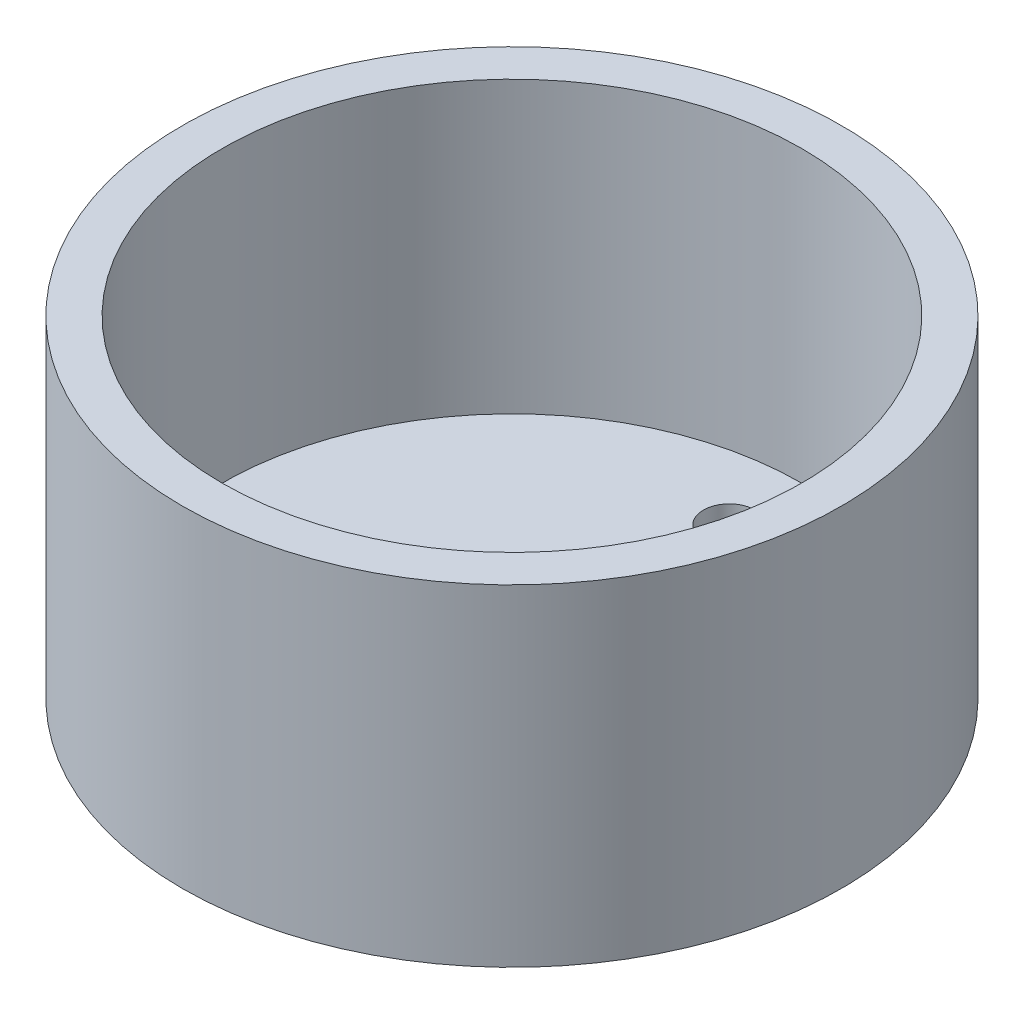
ISO-10303-21;
HEADER;
FILE_DESCRIPTION(('STEP AP214'),'2;1');
FILE_NAME('part.step','',(''),(''),'','','');
FILE_SCHEMA(('AUTOMOTIVE_DESIGN { 1 0 10303 214 1 1 1 1 }'));
ENDSEC;
DATA;
#1=APPLICATION_CONTEXT('core data for automotive mechanical design processes');
#2=APPLICATION_PROTOCOL_DEFINITION('international standard','automotive_design',2000,#1);
#3=PRODUCT_CONTEXT('',#1,'mechanical');
#4=PRODUCT('Part','Part','',(#3));
#5=PRODUCT_RELATED_PRODUCT_CATEGORY('part','',(#4));
#6=PRODUCT_DEFINITION_FORMATION('','',#4);
#7=PRODUCT_DEFINITION_CONTEXT('part definition',#1,'design');
#8=PRODUCT_DEFINITION('design','',#6,#7);
#9=PRODUCT_DEFINITION_SHAPE('','',#8);
#10=(LENGTH_UNIT() NAMED_UNIT(*) SI_UNIT(.MILLI.,.METRE.));
#11=(NAMED_UNIT(*) PLANE_ANGLE_UNIT() SI_UNIT($,.RADIAN.));
#12=(NAMED_UNIT(*) SI_UNIT($,.STERADIAN.) SOLID_ANGLE_UNIT());
#13=UNCERTAINTY_MEASURE_WITH_UNIT(LENGTH_MEASURE(1.E-05),#10,'distance_accuracy_value','');
#14=(GEOMETRIC_REPRESENTATION_CONTEXT(3) GLOBAL_UNCERTAINTY_ASSIGNED_CONTEXT((#13)) GLOBAL_UNIT_ASSIGNED_CONTEXT((#10,
#11,#12)) REPRESENTATION_CONTEXT('',''));
#15=CARTESIAN_POINT('',(0.,0.,0.));
#16=DIRECTION('',(0.,0.,1.));
#17=DIRECTION('',(1.,0.,0.));
#18=AXIS2_PLACEMENT_3D('',#15,#16,#17);
#19=CARTESIAN_POINT('',(0.,50.8,0.));
#20=DIRECTION('',(0.,-1.,0.));
#21=DIRECTION('',(0.,0.,-1.));
#22=AXIS2_PLACEMENT_3D('',#19,#20,#21);
#23=CYLINDRICAL_SURFACE('',#22,50.546);
#24=CARTESIAN_POINT('',(0.,50.8,0.));
#25=DIRECTION('',(0.,1.,0.));
#26=DIRECTION('',(0.,0.,1.));
#27=AXIS2_PLACEMENT_3D('',#24,#25,#26);
#28=CIRCLE('',#27,50.546);
#29=CARTESIAN_POINT('',(0.,50.8,50.546));
#30=VERTEX_POINT('',#29);
#31=EDGE_CURVE('E10',#30,#30,#28,.T.);
#32=ORIENTED_EDGE('',*,*,#31,.F.);
#33=EDGE_LOOP('',(#32));
#34=FACE_BOUND('',#33,.T.);
#35=CARTESIAN_POINT('',(0.,0.,0.));
#36=DIRECTION('',(0.,1.,0.));
#37=DIRECTION('',(0.,0.,1.));
#38=AXIS2_PLACEMENT_3D('',#35,#36,#37);
#39=CIRCLE('',#38,50.546);
#40=CARTESIAN_POINT('',(0.,0.,50.546));
#41=VERTEX_POINT('',#40);
#42=EDGE_CURVE('E38',#41,#41,#39,.T.);
#43=ORIENTED_EDGE('',*,*,#42,.T.);
#44=EDGE_LOOP('',(#43));
#45=FACE_BOUND('',#44,.T.);
#46=ADVANCED_FACE('F31',(#34,#45),#23,.T.);
#47=CARTESIAN_POINT('',(0.,50.8,0.));
#48=DIRECTION('',(0.,1.,0.));
#49=DIRECTION('',(0.,0.,1.));
#50=AXIS2_PLACEMENT_3D('',#47,#48,#49);
#51=PLANE('',#50);
#52=CARTESIAN_POINT('',(0.,50.8,0.));
#53=DIRECTION('',(0.,1.,0.));
#54=DIRECTION('',(0.,0.,1.));
#55=AXIS2_PLACEMENT_3D('',#52,#53,#54);
#56=CIRCLE('',#55,44.45);
#57=CARTESIAN_POINT('',(0.,50.8,44.45));
#58=VERTEX_POINT('',#57);
#59=EDGE_CURVE('E46',#58,#58,#56,.T.);
#60=ORIENTED_EDGE('',*,*,#59,.F.);
#61=EDGE_LOOP('',(#60));
#62=FACE_BOUND('',#61,.T.);
#63=ORIENTED_EDGE('',*,*,#31,.T.);
#64=EDGE_LOOP('',(#63));
#65=FACE_BOUND('',#64,.T.);
#66=ADVANCED_FACE('F69',(#62,#65),#51,.T.);
#67=CARTESIAN_POINT('',(0.,0.,0.));
#68=DIRECTION('',(0.,1.,0.));
#69=DIRECTION('',(0.,0.,1.));
#70=AXIS2_PLACEMENT_3D('',#67,#68,#69);
#71=PLANE('',#70);
#72=CARTESIAN_POINT('',(0.,0.,33.3375));
#73=DIRECTION('',(0.,-1.,0.));
#74=DIRECTION('',(0.,0.,-1.));
#75=AXIS2_PLACEMENT_3D('',#72,#73,#74);
#76=CIRCLE('',#75,3.96875);
#77=CARTESIAN_POINT('',(0.,0.,29.36875));
#78=VERTEX_POINT('',#77);
#79=EDGE_CURVE('E50',#78,#78,#76,.T.);
#80=ORIENTED_EDGE('',*,*,#79,.F.);
#81=EDGE_LOOP('',(#80));
#82=FACE_BOUND('',#81,.T.);
#83=CARTESIAN_POINT('',(0.,0.,-33.3375));
#84=DIRECTION('',(0.,-1.,0.));
#85=DIRECTION('',(0.,0.,-1.));
#86=AXIS2_PLACEMENT_3D('',#83,#84,#85);
#87=CIRCLE('',#86,3.96875);
#88=CARTESIAN_POINT('',(0.,0.,-37.30625));
#89=VERTEX_POINT('',#88);
#90=EDGE_CURVE('E55',#89,#89,#87,.T.);
#91=ORIENTED_EDGE('',*,*,#90,.F.);
#92=EDGE_LOOP('',(#91));
#93=FACE_BOUND('',#92,.T.);
#94=ORIENTED_EDGE('',*,*,#42,.F.);
#95=EDGE_LOOP('',(#94));
#96=FACE_BOUND('',#95,.T.);
#97=ADVANCED_FACE('F71',(#82,#93,#96),#71,.F.);
#98=CARTESIAN_POINT('',(0.,6.35,0.));
#99=DIRECTION('',(0.,1.,0.));
#100=DIRECTION('',(0.,0.,1.));
#101=AXIS2_PLACEMENT_3D('',#98,#99,#100);
#102=CYLINDRICAL_SURFACE('',#101,44.45);
#103=CARTESIAN_POINT('',(0.,6.35,0.));
#104=DIRECTION('',(0.,1.,0.));
#105=DIRECTION('',(0.,0.,1.));
#106=AXIS2_PLACEMENT_3D('',#103,#104,#105);
#107=CIRCLE('',#106,44.45);
#108=CARTESIAN_POINT('',(0.,6.35,44.45));
#109=VERTEX_POINT('',#108);
#110=EDGE_CURVE('E43',#109,#109,#107,.T.);
#111=ORIENTED_EDGE('',*,*,#110,.F.);
#112=EDGE_LOOP('',(#111));
#113=FACE_BOUND('',#112,.T.);
#114=ORIENTED_EDGE('',*,*,#59,.T.);
#115=EDGE_LOOP('',(#114));
#116=FACE_BOUND('',#115,.T.);
#117=ADVANCED_FACE('F67',(#113,#116),#102,.F.);
#118=CARTESIAN_POINT('',(0.,6.35,0.));
#119=DIRECTION('',(0.,1.,0.));
#120=DIRECTION('',(0.,0.,1.));
#121=AXIS2_PLACEMENT_3D('',#118,#119,#120);
#122=PLANE('',#121);
#123=CARTESIAN_POINT('',(0.,6.35,33.3375));
#124=DIRECTION('',(0.,1.,0.));
#125=DIRECTION('',(0.,0.,1.));
#126=AXIS2_PLACEMENT_3D('',#123,#124,#125);
#127=CIRCLE('',#126,3.96875);
#128=CARTESIAN_POINT('',(0.,6.35,37.30625));
#129=VERTEX_POINT('',#128);
#130=EDGE_CURVE('E34',#129,#129,#127,.T.);
#131=ORIENTED_EDGE('',*,*,#130,.F.);
#132=EDGE_LOOP('',(#131));
#133=FACE_BOUND('',#132,.T.);
#134=CARTESIAN_POINT('',(0.,6.35,-33.3375));
#135=DIRECTION('',(0.,1.,0.));
#136=DIRECTION('',(0.,0.,1.));
#137=AXIS2_PLACEMENT_3D('',#134,#135,#136);
#138=CIRCLE('',#137,3.96875);
#139=CARTESIAN_POINT('',(0.,6.35,-29.36875));
#140=VERTEX_POINT('',#139);
#141=EDGE_CURVE('E48',#140,#140,#138,.T.);
#142=ORIENTED_EDGE('',*,*,#141,.F.);
#143=EDGE_LOOP('',(#142));
#144=FACE_BOUND('',#143,.T.);
#145=ORIENTED_EDGE('',*,*,#110,.T.);
#146=EDGE_LOOP('',(#145));
#147=FACE_BOUND('',#146,.T.);
#148=ADVANCED_FACE('F82',(#133,#144,#147),#122,.T.);
#149=CARTESIAN_POINT('',(0.,44.45,-33.3375));
#150=DIRECTION('',(0.,-1.,0.));
#151=DIRECTION('',(0.,0.,-1.));
#152=AXIS2_PLACEMENT_3D('',#149,#150,#151);
#153=CYLINDRICAL_SURFACE('',#152,3.96875);
#154=ORIENTED_EDGE('',*,*,#141,.T.);
#155=EDGE_LOOP('',(#154));
#156=FACE_BOUND('',#155,.T.);
#157=ORIENTED_EDGE('',*,*,#90,.T.);
#158=EDGE_LOOP('',(#157));
#159=FACE_BOUND('',#158,.T.);
#160=ADVANCED_FACE('F86',(#156,#159),#153,.F.);
#161=CARTESIAN_POINT('',(0.,44.45,33.3375));
#162=DIRECTION('',(0.,-1.,0.));
#163=DIRECTION('',(0.,0.,-1.));
#164=AXIS2_PLACEMENT_3D('',#161,#162,#163);
#165=CYLINDRICAL_SURFACE('',#164,3.96875);
#166=ORIENTED_EDGE('',*,*,#130,.T.);
#167=EDGE_LOOP('',(#166));
#168=FACE_BOUND('',#167,.T.);
#169=ORIENTED_EDGE('',*,*,#79,.T.);
#170=EDGE_LOOP('',(#169));
#171=FACE_BOUND('',#170,.T.);
#172=ADVANCED_FACE('F90',(#168,#171),#165,.F.);
#173=CLOSED_SHELL('',(#46,#66,#97,#117,#148,#160,#172));
#174=MANIFOLD_SOLID_BREP('B2',#173);
#175=ADVANCED_BREP_SHAPE_REPRESENTATION('',(#18,#174),#14);
#176=SHAPE_DEFINITION_REPRESENTATION(#9,#175);
ENDSEC;
END-ISO-10303-21;
